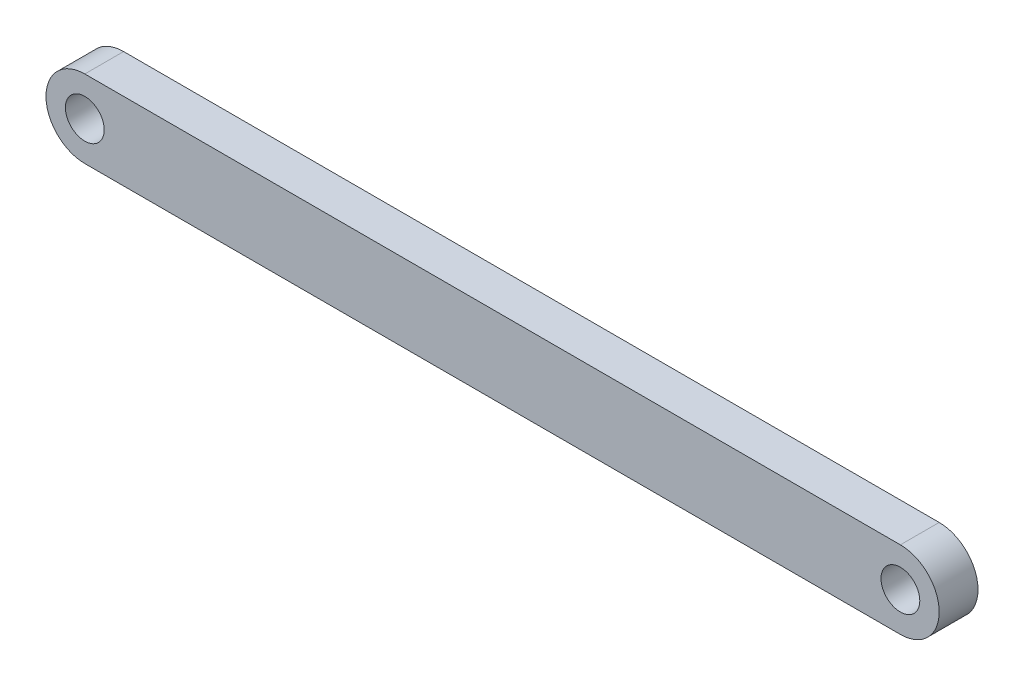
ISO-10303-21;
HEADER;
FILE_DESCRIPTION(('STEP AP214'),'2;1');
FILE_NAME('part.step','',(''),(''),'','','');
FILE_SCHEMA(('AUTOMOTIVE_DESIGN { 1 0 10303 214 1 1 1 1 }'));
ENDSEC;
DATA;
#1=APPLICATION_CONTEXT('core data for automotive mechanical design processes');
#2=APPLICATION_PROTOCOL_DEFINITION('international standard','automotive_design',2000,#1);
#3=PRODUCT_CONTEXT('',#1,'mechanical');
#4=PRODUCT('Part','Part','',(#3));
#5=PRODUCT_RELATED_PRODUCT_CATEGORY('part','',(#4));
#6=PRODUCT_DEFINITION_FORMATION('','',#4);
#7=PRODUCT_DEFINITION_CONTEXT('part definition',#1,'design');
#8=PRODUCT_DEFINITION('design','',#6,#7);
#9=PRODUCT_DEFINITION_SHAPE('','',#8);
#10=(LENGTH_UNIT() NAMED_UNIT(*) SI_UNIT(.MILLI.,.METRE.));
#11=(NAMED_UNIT(*) PLANE_ANGLE_UNIT() SI_UNIT($,.RADIAN.));
#12=(NAMED_UNIT(*) SI_UNIT($,.STERADIAN.) SOLID_ANGLE_UNIT());
#13=UNCERTAINTY_MEASURE_WITH_UNIT(LENGTH_MEASURE(1.E-05),#10,'distance_accuracy_value','');
#14=(GEOMETRIC_REPRESENTATION_CONTEXT(3) GLOBAL_UNCERTAINTY_ASSIGNED_CONTEXT((#13)) GLOBAL_UNIT_ASSIGNED_CONTEXT((#10,
#11,#12)) REPRESENTATION_CONTEXT('',''));
#15=CARTESIAN_POINT('',(0.,0.,0.));
#16=DIRECTION('',(0.,0.,1.));
#17=DIRECTION('',(1.,0.,0.));
#18=AXIS2_PLACEMENT_3D('',#15,#16,#17);
#19=CARTESIAN_POINT('',(52.54,0.,5.));
#20=DIRECTION('',(0.,0.,-1.));
#21=DIRECTION('',(-1.,0.,0.));
#22=AXIS2_PLACEMENT_3D('',#19,#20,#21);
#23=PLANE('',#22);
#24=CARTESIAN_POINT('',(52.54,0.,5.));
#25=DIRECTION('',(0.,0.,1.));
#26=DIRECTION('',(-1.,0.,0.));
#27=AXIS2_PLACEMENT_3D('',#24,#25,#26);
#28=CIRCLE('',#27,5.);
#29=CARTESIAN_POINT('',(52.54,-5.,5.));
#30=VERTEX_POINT('',#29);
#31=CARTESIAN_POINT('',(52.54,5.,5.));
#32=VERTEX_POINT('',#31);
#33=EDGE_CURVE('E96',#30,#32,#28,.T.);
#34=ORIENTED_EDGE('',*,*,#33,.T.);
#35=DIRECTION('',(-1.,0.,0.));
#36=VECTOR('',#35,1.);
#37=CARTESIAN_POINT('',(-52.54,5.,5.));
#38=LINE('',#37,#36);
#39=CARTESIAN_POINT('',(-52.54,5.,5.));
#40=VERTEX_POINT('',#39);
#41=EDGE_CURVE('E91',#32,#40,#38,.T.);
#42=ORIENTED_EDGE('',*,*,#41,.T.);
#43=CARTESIAN_POINT('',(-52.54,0.,5.));
#44=DIRECTION('',(0.,0.,1.));
#45=DIRECTION('',(1.,0.,0.));
#46=AXIS2_PLACEMENT_3D('',#43,#44,#45);
#47=CIRCLE('',#46,5.);
#48=CARTESIAN_POINT('',(-52.54,-5.,5.));
#49=VERTEX_POINT('',#48);
#50=EDGE_CURVE('E94',#40,#49,#47,.T.);
#51=ORIENTED_EDGE('',*,*,#50,.T.);
#52=DIRECTION('',(1.,0.,0.));
#53=VECTOR('',#52,1.);
#54=CARTESIAN_POINT('',(-52.54,-5.,5.));
#55=LINE('',#54,#53);
#56=EDGE_CURVE('E61',#49,#30,#55,.T.);
#57=ORIENTED_EDGE('',*,*,#56,.T.);
#58=EDGE_LOOP('',(#34,#42,#51,#57));
#59=FACE_BOUND('',#58,.T.);
#60=CARTESIAN_POINT('',(-52.54,0.,5.));
#61=DIRECTION('',(0.,0.,1.));
#62=DIRECTION('',(1.,0.,0.));
#63=AXIS2_PLACEMENT_3D('',#60,#61,#62);
#64=CIRCLE('',#63,2.5);
#65=CARTESIAN_POINT('',(-50.04,0.,5.));
#66=VERTEX_POINT('',#65);
#67=EDGE_CURVE('E116',#66,#66,#64,.T.);
#68=ORIENTED_EDGE('',*,*,#67,.F.);
#69=EDGE_LOOP('',(#68));
#70=FACE_BOUND('',#69,.T.);
#71=CARTESIAN_POINT('',(52.54,0.,5.));
#72=DIRECTION('',(0.,0.,1.));
#73=DIRECTION('',(1.,0.,0.));
#74=AXIS2_PLACEMENT_3D('',#71,#72,#73);
#75=CIRCLE('',#74,2.5);
#76=CARTESIAN_POINT('',(55.04,0.,5.));
#77=VERTEX_POINT('',#76);
#78=EDGE_CURVE('E138',#77,#77,#75,.T.);
#79=ORIENTED_EDGE('',*,*,#78,.F.);
#80=EDGE_LOOP('',(#79));
#81=FACE_BOUND('',#80,.T.);
#82=ADVANCED_FACE('F43',(#59,#70,#81),#23,.F.);
#83=CARTESIAN_POINT('',(52.54,0.,0.));
#84=DIRECTION('',(0.,0.,-1.));
#85=DIRECTION('',(-1.,0.,0.));
#86=AXIS2_PLACEMENT_3D('',#83,#84,#85);
#87=PLANE('',#86);
#88=CARTESIAN_POINT('',(-52.54,0.,0.));
#89=DIRECTION('',(0.,0.,1.));
#90=DIRECTION('',(1.,0.,0.));
#91=AXIS2_PLACEMENT_3D('',#88,#89,#90);
#92=CIRCLE('',#91,2.5);
#93=CARTESIAN_POINT('',(-50.04,0.,0.));
#94=VERTEX_POINT('',#93);
#95=EDGE_CURVE('E134',#94,#94,#92,.T.);
#96=ORIENTED_EDGE('',*,*,#95,.T.);
#97=EDGE_LOOP('',(#96));
#98=FACE_BOUND('',#97,.T.);
#99=CARTESIAN_POINT('',(52.54,0.,0.));
#100=DIRECTION('',(0.,0.,1.));
#101=DIRECTION('',(-1.,0.,0.));
#102=AXIS2_PLACEMENT_3D('',#99,#100,#101);
#103=CIRCLE('',#102,5.);
#104=CARTESIAN_POINT('',(52.54,-5.,0.));
#105=VERTEX_POINT('',#104);
#106=CARTESIAN_POINT('',(52.54,5.,0.));
#107=VERTEX_POINT('',#106);
#108=EDGE_CURVE('E112',#105,#107,#103,.T.);
#109=ORIENTED_EDGE('',*,*,#108,.F.);
#110=DIRECTION('',(1.,0.,0.));
#111=VECTOR('',#110,1.);
#112=CARTESIAN_POINT('',(-52.54,-5.,0.));
#113=LINE('',#112,#111);
#114=CARTESIAN_POINT('',(-52.54,-5.,0.));
#115=VERTEX_POINT('',#114);
#116=EDGE_CURVE('E84',#115,#105,#113,.T.);
#117=ORIENTED_EDGE('',*,*,#116,.F.);
#118=CARTESIAN_POINT('',(-52.54,0.,0.));
#119=DIRECTION('',(0.,0.,1.));
#120=DIRECTION('',(1.,0.,0.));
#121=AXIS2_PLACEMENT_3D('',#118,#119,#120);
#122=CIRCLE('',#121,5.);
#123=CARTESIAN_POINT('',(-52.54,5.,0.));
#124=VERTEX_POINT('',#123);
#125=EDGE_CURVE('E78',#124,#115,#122,.T.);
#126=ORIENTED_EDGE('',*,*,#125,.F.);
#127=DIRECTION('',(-1.,0.,0.));
#128=VECTOR('',#127,1.);
#129=CARTESIAN_POINT('',(-52.54,5.,0.));
#130=LINE('',#129,#128);
#131=EDGE_CURVE('E101',#107,#124,#130,.T.);
#132=ORIENTED_EDGE('',*,*,#131,.F.);
#133=EDGE_LOOP('',(#109,#117,#126,#132));
#134=FACE_BOUND('',#133,.T.);
#135=CARTESIAN_POINT('',(52.54,0.,0.));
#136=DIRECTION('',(0.,0.,1.));
#137=DIRECTION('',(1.,0.,0.));
#138=AXIS2_PLACEMENT_3D('',#135,#136,#137);
#139=CIRCLE('',#138,2.5);
#140=CARTESIAN_POINT('',(55.04,0.,0.));
#141=VERTEX_POINT('',#140);
#142=EDGE_CURVE('E142',#141,#141,#139,.T.);
#143=ORIENTED_EDGE('',*,*,#142,.T.);
#144=EDGE_LOOP('',(#143));
#145=FACE_BOUND('',#144,.T.);
#146=ADVANCED_FACE('F129',(#98,#134,#145),#87,.T.);
#147=CARTESIAN_POINT('',(52.54,0.,5.));
#148=DIRECTION('',(0.,0.,-1.));
#149=DIRECTION('',(-1.,0.,0.));
#150=AXIS2_PLACEMENT_3D('',#147,#148,#149);
#151=CYLINDRICAL_SURFACE('',#150,5.);
#152=ORIENTED_EDGE('',*,*,#108,.T.);
#153=DIRECTION('',(0.,0.,-1.));
#154=VECTOR('',#153,1.);
#155=CARTESIAN_POINT('',(52.54,5.,5.));
#156=LINE('',#155,#154);
#157=EDGE_CURVE('E11',#32,#107,#156,.T.);
#158=ORIENTED_EDGE('',*,*,#157,.F.);
#159=ORIENTED_EDGE('',*,*,#33,.F.);
#160=DIRECTION('',(0.,0.,-1.));
#161=VECTOR('',#160,1.);
#162=CARTESIAN_POINT('',(52.54,-5.,5.));
#163=LINE('',#162,#161);
#164=EDGE_CURVE('E108',#30,#105,#163,.T.);
#165=ORIENTED_EDGE('',*,*,#164,.T.);
#166=EDGE_LOOP('',(#152,#158,#159,#165));
#167=FACE_BOUND('',#166,.T.);
#168=ADVANCED_FACE('F45',(#167),#151,.T.);
#169=CARTESIAN_POINT('',(-52.54,5.,5.));
#170=DIRECTION('',(0.,-1.,0.));
#171=DIRECTION('',(0.,0.,-1.));
#172=AXIS2_PLACEMENT_3D('',#169,#170,#171);
#173=PLANE('',#172);
#174=ORIENTED_EDGE('',*,*,#131,.T.);
#175=DIRECTION('',(0.,0.,-1.));
#176=VECTOR('',#175,1.);
#177=CARTESIAN_POINT('',(-52.54,5.,5.));
#178=LINE('',#177,#176);
#179=EDGE_CURVE('E53',#40,#124,#178,.T.);
#180=ORIENTED_EDGE('',*,*,#179,.F.);
#181=ORIENTED_EDGE('',*,*,#41,.F.);
#182=ORIENTED_EDGE('',*,*,#157,.T.);
#183=EDGE_LOOP('',(#174,#180,#181,#182));
#184=FACE_BOUND('',#183,.T.);
#185=ADVANCED_FACE('F100',(#184),#173,.F.);
#186=CARTESIAN_POINT('',(-52.54,0.,5.));
#187=DIRECTION('',(0.,0.,-1.));
#188=DIRECTION('',(-1.,0.,0.));
#189=AXIS2_PLACEMENT_3D('',#186,#187,#188);
#190=CYLINDRICAL_SURFACE('',#189,5.);
#191=ORIENTED_EDGE('',*,*,#125,.T.);
#192=DIRECTION('',(0.,0.,-1.));
#193=VECTOR('',#192,1.);
#194=CARTESIAN_POINT('',(-52.54,-5.,5.));
#195=LINE('',#194,#193);
#196=EDGE_CURVE('E103',#49,#115,#195,.T.);
#197=ORIENTED_EDGE('',*,*,#196,.F.);
#198=ORIENTED_EDGE('',*,*,#50,.F.);
#199=ORIENTED_EDGE('',*,*,#179,.T.);
#200=EDGE_LOOP('',(#191,#197,#198,#199));
#201=FACE_BOUND('',#200,.T.);
#202=ADVANCED_FACE('F104',(#201),#190,.T.);
#203=CARTESIAN_POINT('',(-52.54,-5.,5.));
#204=DIRECTION('',(0.,1.,0.));
#205=DIRECTION('',(0.,0.,1.));
#206=AXIS2_PLACEMENT_3D('',#203,#204,#205);
#207=PLANE('',#206);
#208=ORIENTED_EDGE('',*,*,#116,.T.);
#209=ORIENTED_EDGE('',*,*,#164,.F.);
#210=ORIENTED_EDGE('',*,*,#56,.F.);
#211=ORIENTED_EDGE('',*,*,#196,.T.);
#212=EDGE_LOOP('',(#208,#209,#210,#211));
#213=FACE_BOUND('',#212,.T.);
#214=ADVANCED_FACE('F126',(#213),#207,.F.);
#215=CARTESIAN_POINT('',(-52.54,0.,5.));
#216=DIRECTION('',(0.,0.,-1.));
#217=DIRECTION('',(-1.,0.,0.));
#218=AXIS2_PLACEMENT_3D('',#215,#216,#217);
#219=CYLINDRICAL_SURFACE('',#218,2.5);
#220=ORIENTED_EDGE('',*,*,#67,.T.);
#221=EDGE_LOOP('',(#220));
#222=FACE_BOUND('',#221,.T.);
#223=ORIENTED_EDGE('',*,*,#95,.F.);
#224=EDGE_LOOP('',(#223));
#225=FACE_BOUND('',#224,.T.);
#226=ADVANCED_FACE('F161',(#222,#225),#219,.F.);
#227=CARTESIAN_POINT('',(52.54,0.,5.));
#228=DIRECTION('',(0.,0.,-1.));
#229=DIRECTION('',(-1.,0.,0.));
#230=AXIS2_PLACEMENT_3D('',#227,#228,#229);
#231=CYLINDRICAL_SURFACE('',#230,2.5);
#232=ORIENTED_EDGE('',*,*,#78,.T.);
#233=EDGE_LOOP('',(#232));
#234=FACE_BOUND('',#233,.T.);
#235=ORIENTED_EDGE('',*,*,#142,.F.);
#236=EDGE_LOOP('',(#235));
#237=FACE_BOUND('',#236,.T.);
#238=ADVANCED_FACE('F150',(#234,#237),#231,.F.);
#239=CLOSED_SHELL('',(#82,#146,#168,#185,#202,#214,#226,#238));
#240=MANIFOLD_SOLID_BREP('B2',#239);
#241=ADVANCED_BREP_SHAPE_REPRESENTATION('',(#18,#240),#14);
#242=SHAPE_DEFINITION_REPRESENTATION(#9,#241);
ENDSEC;
END-ISO-10303-21;
